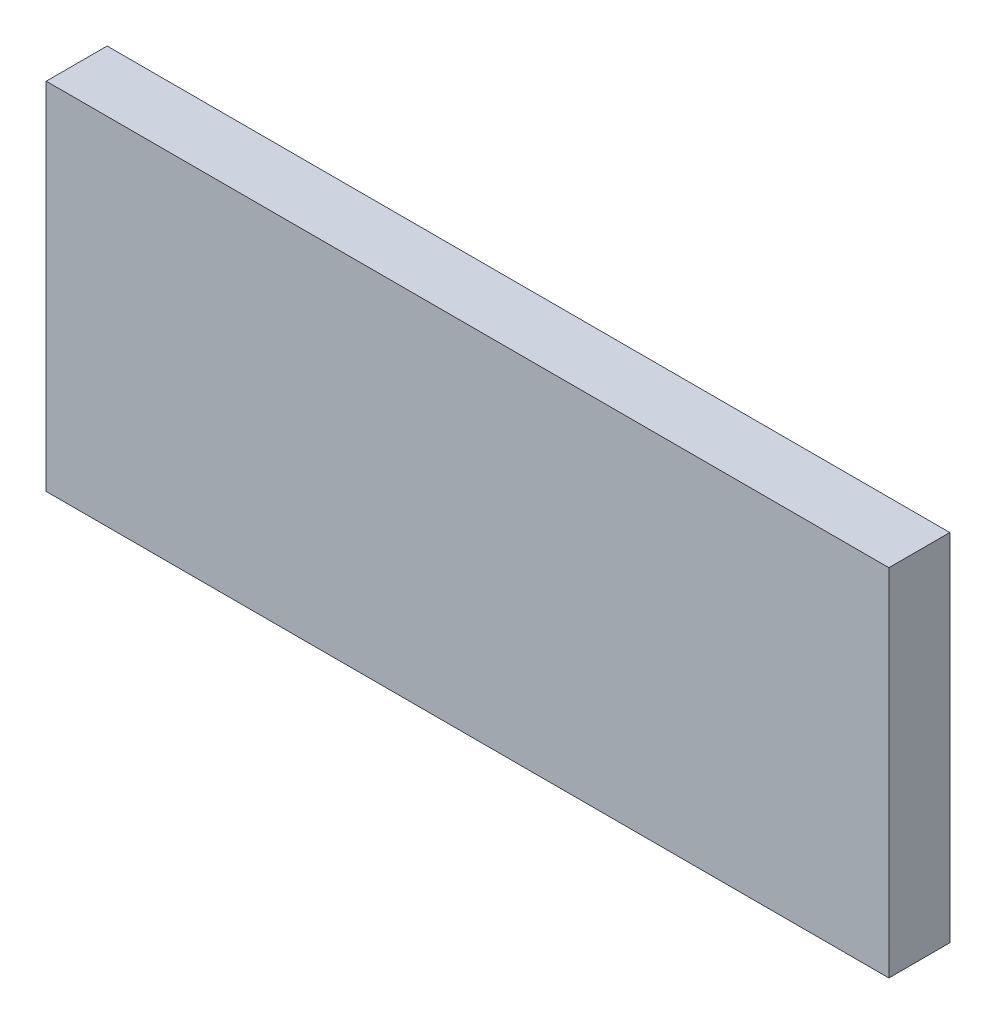
ISO-10303-21;
HEADER;
FILE_DESCRIPTION(('STEP AP214'),'2;1');
FILE_NAME('part.step','',(''),(''),'','','');
FILE_SCHEMA(('AUTOMOTIVE_DESIGN { 1 0 10303 214 1 1 1 1 }'));
ENDSEC;
DATA;
#1=APPLICATION_CONTEXT('core data for automotive mechanical design processes');
#2=APPLICATION_PROTOCOL_DEFINITION('international standard','automotive_design',2000,#1);
#3=PRODUCT_CONTEXT('',#1,'mechanical');
#4=PRODUCT('Part','Part','',(#3));
#5=PRODUCT_RELATED_PRODUCT_CATEGORY('part','',(#4));
#6=PRODUCT_DEFINITION_FORMATION('','',#4);
#7=PRODUCT_DEFINITION_CONTEXT('part definition',#1,'design');
#8=PRODUCT_DEFINITION('design','',#6,#7);
#9=PRODUCT_DEFINITION_SHAPE('','',#8);
#10=(LENGTH_UNIT() NAMED_UNIT(*) SI_UNIT(.MILLI.,.METRE.));
#11=(NAMED_UNIT(*) PLANE_ANGLE_UNIT() SI_UNIT($,.RADIAN.));
#12=(NAMED_UNIT(*) SI_UNIT($,.STERADIAN.) SOLID_ANGLE_UNIT());
#13=UNCERTAINTY_MEASURE_WITH_UNIT(LENGTH_MEASURE(1.E-05),#10,'distance_accuracy_value','');
#14=(GEOMETRIC_REPRESENTATION_CONTEXT(3) GLOBAL_UNCERTAINTY_ASSIGNED_CONTEXT((#13)) GLOBAL_UNIT_ASSIGNED_CONTEXT((#10,
#11,#12)) REPRESENTATION_CONTEXT('',''));
#15=CARTESIAN_POINT('',(0.,0.,0.));
#16=DIRECTION('',(0.,0.,1.));
#17=DIRECTION('',(1.,0.,0.));
#18=AXIS2_PLACEMENT_3D('',#15,#16,#17);
#19=CARTESIAN_POINT('',(583.,70.,12.));
#20=DIRECTION('',(-1.,0.,0.));
#21=DIRECTION('',(0.,-1.,0.));
#22=AXIS2_PLACEMENT_3D('',#19,#20,#21);
#23=PLANE('',#22);
#24=DIRECTION('',(0.,1.,0.));
#25=VECTOR('',#24,1.);
#26=CARTESIAN_POINT('',(583.,70.,0.));
#27=LINE('',#26,#25);
#28=CARTESIAN_POINT('',(583.,0.,0.));
#29=VERTEX_POINT('',#28);
#30=CARTESIAN_POINT('',(583.,70.,0.));
#31=VERTEX_POINT('',#30);
#32=EDGE_CURVE('E96',#29,#31,#27,.T.);
#33=ORIENTED_EDGE('',*,*,#32,.T.);
#34=DIRECTION('',(0.,0.,-1.));
#35=VECTOR('',#34,1.);
#36=CARTESIAN_POINT('',(583.,70.,12.));
#37=LINE('',#36,#35);
#38=CARTESIAN_POINT('',(583.,70.,12.));
#39=VERTEX_POINT('',#38);
#40=EDGE_CURVE('E11',#39,#31,#37,.T.);
#41=ORIENTED_EDGE('',*,*,#40,.F.);
#42=DIRECTION('',(0.,1.,0.));
#43=VECTOR('',#42,1.);
#44=CARTESIAN_POINT('',(583.,70.,12.));
#45=LINE('',#44,#43);
#46=CARTESIAN_POINT('',(583.,0.,12.));
#47=VERTEX_POINT('',#46);
#48=EDGE_CURVE('E84',#47,#39,#45,.T.);
#49=ORIENTED_EDGE('',*,*,#48,.F.);
#50=DIRECTION('',(0.,0.,-1.));
#51=VECTOR('',#50,1.);
#52=CARTESIAN_POINT('',(583.,0.,12.));
#53=LINE('',#52,#51);
#54=EDGE_CURVE('E92',#47,#29,#53,.T.);
#55=ORIENTED_EDGE('',*,*,#54,.T.);
#56=EDGE_LOOP('',(#33,#41,#49,#55));
#57=FACE_BOUND('',#56,.T.);
#58=ADVANCED_FACE('F33',(#57),#23,.F.);
#59=CARTESIAN_POINT('',(417.,70.,12.));
#60=DIRECTION('',(0.,-1.,0.));
#61=DIRECTION('',(0.,0.,-1.));
#62=AXIS2_PLACEMENT_3D('',#59,#60,#61);
#63=PLANE('',#62);
#64=DIRECTION('',(-1.,0.,0.));
#65=VECTOR('',#64,1.);
#66=CARTESIAN_POINT('',(417.,70.,0.));
#67=LINE('',#66,#65);
#68=CARTESIAN_POINT('',(417.,70.,0.));
#69=VERTEX_POINT('',#68);
#70=EDGE_CURVE('E88',#31,#69,#67,.T.);
#71=ORIENTED_EDGE('',*,*,#70,.T.);
#72=DIRECTION('',(0.,0.,-1.));
#73=VECTOR('',#72,1.);
#74=CARTESIAN_POINT('',(417.,70.,12.));
#75=LINE('',#74,#73);
#76=CARTESIAN_POINT('',(417.,70.,12.));
#77=VERTEX_POINT('',#76);
#78=EDGE_CURVE('E41',#77,#69,#75,.T.);
#79=ORIENTED_EDGE('',*,*,#78,.F.);
#80=DIRECTION('',(-1.,0.,0.));
#81=VECTOR('',#80,1.);
#82=CARTESIAN_POINT('',(417.,70.,12.));
#83=LINE('',#82,#81);
#84=EDGE_CURVE('E79',#39,#77,#83,.T.);
#85=ORIENTED_EDGE('',*,*,#84,.F.);
#86=ORIENTED_EDGE('',*,*,#40,.T.);
#87=EDGE_LOOP('',(#71,#79,#85,#86));
#88=FACE_BOUND('',#87,.T.);
#89=ADVANCED_FACE('F87',(#88),#63,.F.);
#90=CARTESIAN_POINT('',(417.,70.,12.));
#91=DIRECTION('',(1.,0.,0.));
#92=DIRECTION('',(0.,1.,0.));
#93=AXIS2_PLACEMENT_3D('',#90,#91,#92);
#94=PLANE('',#93);
#95=DIRECTION('',(0.,-1.,0.));
#96=VECTOR('',#95,1.);
#97=CARTESIAN_POINT('',(417.,70.,0.));
#98=LINE('',#97,#96);
#99=CARTESIAN_POINT('',(417.,0.,0.));
#100=VERTEX_POINT('',#99);
#101=EDGE_CURVE('E66',#69,#100,#98,.T.);
#102=ORIENTED_EDGE('',*,*,#101,.T.);
#103=DIRECTION('',(0.,0.,-1.));
#104=VECTOR('',#103,1.);
#105=CARTESIAN_POINT('',(417.,0.,12.));
#106=LINE('',#105,#104);
#107=CARTESIAN_POINT('',(417.,0.,12.));
#108=VERTEX_POINT('',#107);
#109=EDGE_CURVE('E89',#108,#100,#106,.T.);
#110=ORIENTED_EDGE('',*,*,#109,.F.);
#111=DIRECTION('',(0.,-1.,0.));
#112=VECTOR('',#111,1.);
#113=CARTESIAN_POINT('',(417.,70.,12.));
#114=LINE('',#113,#112);
#115=EDGE_CURVE('E82',#77,#108,#114,.T.);
#116=ORIENTED_EDGE('',*,*,#115,.F.);
#117=ORIENTED_EDGE('',*,*,#78,.T.);
#118=EDGE_LOOP('',(#102,#110,#116,#117));
#119=FACE_BOUND('',#118,.T.);
#120=ADVANCED_FACE('F90',(#119),#94,.F.);
#121=CARTESIAN_POINT('',(417.,0.,12.));
#122=DIRECTION('',(0.,1.,0.));
#123=DIRECTION('',(-1.,0.,0.));
#124=AXIS2_PLACEMENT_3D('',#121,#122,#123);
#125=PLANE('',#124);
#126=DIRECTION('',(1.,0.,0.));
#127=VECTOR('',#126,1.);
#128=CARTESIAN_POINT('',(417.,0.,0.));
#129=LINE('',#128,#127);
#130=EDGE_CURVE('E72',#100,#29,#129,.T.);
#131=ORIENTED_EDGE('',*,*,#130,.T.);
#132=ORIENTED_EDGE('',*,*,#54,.F.);
#133=DIRECTION('',(1.,0.,0.));
#134=VECTOR('',#133,1.);
#135=CARTESIAN_POINT('',(417.,0.,12.));
#136=LINE('',#135,#134);
#137=EDGE_CURVE('E49',#108,#47,#136,.T.);
#138=ORIENTED_EDGE('',*,*,#137,.F.);
#139=ORIENTED_EDGE('',*,*,#109,.T.);
#140=EDGE_LOOP('',(#131,#132,#138,#139));
#141=FACE_BOUND('',#140,.T.);
#142=ADVANCED_FACE('F103',(#141),#125,.F.);
#143=CARTESIAN_POINT('',(0.,0.,12.));
#144=DIRECTION('',(0.,0.,1.));
#145=DIRECTION('',(1.,0.,0.));
#146=AXIS2_PLACEMENT_3D('',#143,#144,#145);
#147=PLANE('',#146);
#148=ORIENTED_EDGE('',*,*,#48,.T.);
#149=ORIENTED_EDGE('',*,*,#84,.T.);
#150=ORIENTED_EDGE('',*,*,#115,.T.);
#151=ORIENTED_EDGE('',*,*,#137,.T.);
#152=EDGE_LOOP('',(#148,#149,#150,#151));
#153=FACE_BOUND('',#152,.T.);
#154=ADVANCED_FACE('F80',(#153),#147,.T.);
#155=CARTESIAN_POINT('',(0.,0.,0.));
#156=DIRECTION('',(0.,0.,1.));
#157=DIRECTION('',(1.,0.,0.));
#158=AXIS2_PLACEMENT_3D('',#155,#156,#157);
#159=PLANE('',#158);
#160=ORIENTED_EDGE('',*,*,#32,.F.);
#161=ORIENTED_EDGE('',*,*,#130,.F.);
#162=ORIENTED_EDGE('',*,*,#101,.F.);
#163=ORIENTED_EDGE('',*,*,#70,.F.);
#164=EDGE_LOOP('',(#160,#161,#162,#163));
#165=FACE_BOUND('',#164,.T.);
#166=ADVANCED_FACE('F106',(#165),#159,.F.);
#167=CLOSED_SHELL('',(#58,#89,#120,#142,#154,#166));
#168=MANIFOLD_SOLID_BREP('B2',#167);
#169=ADVANCED_BREP_SHAPE_REPRESENTATION('',(#18,#168),#14);
#170=SHAPE_DEFINITION_REPRESENTATION(#9,#169);
ENDSEC;
END-ISO-10303-21;
